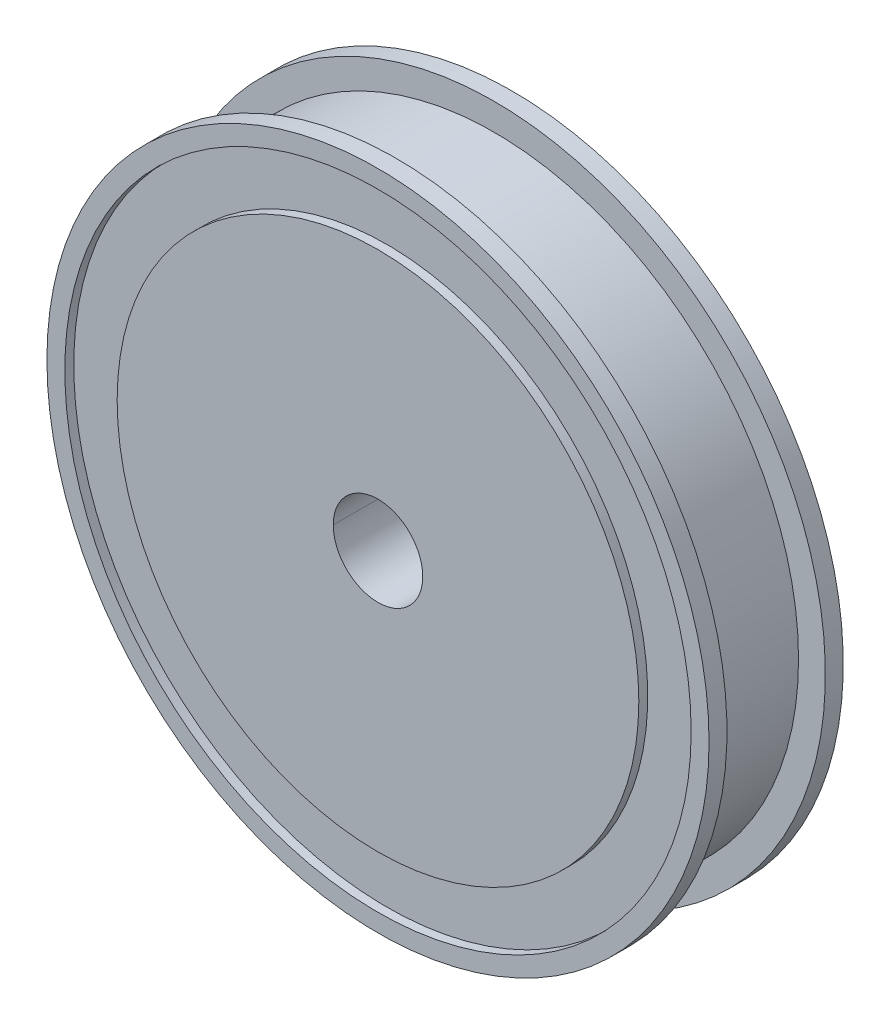
ISO-10303-21;
HEADER;
FILE_DESCRIPTION(('STEP AP214'),'2;1');
FILE_NAME('part.step','',(''),(''),'','','');
FILE_SCHEMA(('AUTOMOTIVE_DESIGN { 1 0 10303 214 1 1 1 1 }'));
ENDSEC;
DATA;
#1=APPLICATION_CONTEXT('core data for automotive mechanical design processes');
#2=APPLICATION_PROTOCOL_DEFINITION('international standard','automotive_design',2000,#1);
#3=PRODUCT_CONTEXT('',#1,'mechanical');
#4=PRODUCT('Part','Part','',(#3));
#5=PRODUCT_RELATED_PRODUCT_CATEGORY('part','',(#4));
#6=PRODUCT_DEFINITION_FORMATION('','',#4);
#7=PRODUCT_DEFINITION_CONTEXT('part definition',#1,'design');
#8=PRODUCT_DEFINITION('design','',#6,#7);
#9=PRODUCT_DEFINITION_SHAPE('','',#8);
#10=(LENGTH_UNIT() NAMED_UNIT(*) SI_UNIT(.MILLI.,.METRE.));
#11=(NAMED_UNIT(*) PLANE_ANGLE_UNIT() SI_UNIT($,.RADIAN.));
#12=(NAMED_UNIT(*) SI_UNIT($,.STERADIAN.) SOLID_ANGLE_UNIT());
#13=UNCERTAINTY_MEASURE_WITH_UNIT(LENGTH_MEASURE(1.E-05),#10,'distance_accuracy_value','');
#14=(GEOMETRIC_REPRESENTATION_CONTEXT(3) GLOBAL_UNCERTAINTY_ASSIGNED_CONTEXT((#13)) GLOBAL_UNIT_ASSIGNED_CONTEXT((#10,
#11,#12)) REPRESENTATION_CONTEXT('',''));
#15=CARTESIAN_POINT('',(0.,0.,0.));
#16=DIRECTION('',(0.,0.,1.));
#17=DIRECTION('',(1.,0.,0.));
#18=AXIS2_PLACEMENT_3D('',#15,#16,#17);
#19=CARTESIAN_POINT('',(0.,0.,1.));
#20=DIRECTION('',(0.,0.,-1.));
#21=DIRECTION('',(-1.,0.,0.));
#22=AXIS2_PLACEMENT_3D('',#19,#20,#21);
#23=CYLINDRICAL_SURFACE('',#22,5.);
#24=CARTESIAN_POINT('',(0.,0.,1.));
#25=DIRECTION('',(0.,0.,-1.));
#26=DIRECTION('',(-1.,0.,0.));
#27=AXIS2_PLACEMENT_3D('',#24,#25,#26);
#28=CIRCLE('',#27,5.);
#29=CARTESIAN_POINT('',(-5.,0.,1.));
#30=VERTEX_POINT('',#29);
#31=CARTESIAN_POINT('',(5.,0.,1.));
#32=VERTEX_POINT('',#31);
#33=EDGE_CURVE('E83',#30,#32,#28,.T.);
#34=ORIENTED_EDGE('',*,*,#33,.F.);
#35=DIRECTION('',(0.,0.,-1.));
#36=VECTOR('',#35,1.);
#37=CARTESIAN_POINT('',(-5.,0.,1.));
#38=LINE('',#37,#36);
#39=CARTESIAN_POINT('',(-5.,0.,-14.));
#40=VERTEX_POINT('',#39);
#41=EDGE_CURVE('E12',#30,#40,#38,.T.);
#42=ORIENTED_EDGE('',*,*,#41,.T.);
#43=CARTESIAN_POINT('',(0.,0.,-14.));
#44=DIRECTION('',(0.,0.,-1.));
#45=DIRECTION('',(-1.,0.,0.));
#46=AXIS2_PLACEMENT_3D('',#43,#44,#45);
#47=CIRCLE('',#46,5.);
#48=CARTESIAN_POINT('',(5.,0.,-14.));
#49=VERTEX_POINT('',#48);
#50=EDGE_CURVE('E92',#40,#49,#47,.T.);
#51=ORIENTED_EDGE('',*,*,#50,.T.);
#52=DIRECTION('',(0.,0.,1.));
#53=VECTOR('',#52,1.);
#54=CARTESIAN_POINT('',(5.,0.,1.));
#55=LINE('',#54,#53);
#56=EDGE_CURVE('E66',#49,#32,#55,.T.);
#57=ORIENTED_EDGE('',*,*,#56,.T.);
#58=EDGE_LOOP('',(#34,#42,#51,#57));
#59=FACE_BOUND('',#58,.T.);
#60=ADVANCED_FACE('F57',(#59),#23,.F.);
#61=CARTESIAN_POINT('',(0.,0.,1.));
#62=DIRECTION('',(0.,0.,-1.));
#63=DIRECTION('',(-1.,0.,0.));
#64=AXIS2_PLACEMENT_3D('',#61,#62,#63);
#65=CYLINDRICAL_SURFACE('',#64,35.);
#66=CARTESIAN_POINT('',(0.,0.,1.));
#67=DIRECTION('',(0.,0.,1.));
#68=DIRECTION('',(1.,0.,0.));
#69=AXIS2_PLACEMENT_3D('',#66,#67,#68);
#70=CIRCLE('',#69,35.);
#71=CARTESIAN_POINT('',(35.,0.,1.));
#72=VERTEX_POINT('',#71);
#73=EDGE_CURVE('E139',#72,#72,#70,.T.);
#74=ORIENTED_EDGE('',*,*,#73,.T.);
#75=EDGE_LOOP('',(#74));
#76=FACE_BOUND('',#75,.T.);
#77=CARTESIAN_POINT('',(0.,0.,0.));
#78=DIRECTION('',(0.,0.,1.));
#79=DIRECTION('',(1.,0.,0.));
#80=AXIS2_PLACEMENT_3D('',#77,#78,#79);
#81=CIRCLE('',#80,35.);
#82=CARTESIAN_POINT('',(35.,0.,0.));
#83=VERTEX_POINT('',#82);
#84=EDGE_CURVE('E138',#83,#83,#81,.T.);
#85=ORIENTED_EDGE('',*,*,#84,.F.);
#86=EDGE_LOOP('',(#85));
#87=FACE_BOUND('',#86,.T.);
#88=ADVANCED_FACE('F59',(#76,#87),#65,.F.);
#89=CARTESIAN_POINT('',(0.,0.,1.));
#90=DIRECTION('',(0.,0.,-1.));
#91=DIRECTION('',(-1.,0.,0.));
#92=AXIS2_PLACEMENT_3D('',#89,#90,#91);
#93=CYLINDRICAL_SURFACE('',#92,37.);
#94=CARTESIAN_POINT('',(0.,0.,1.));
#95=DIRECTION('',(0.,0.,1.));
#96=DIRECTION('',(1.,0.,0.));
#97=AXIS2_PLACEMENT_3D('',#94,#95,#96);
#98=CIRCLE('',#97,37.);
#99=CARTESIAN_POINT('',(37.,0.,1.));
#100=VERTEX_POINT('',#99);
#101=EDGE_CURVE('E143',#100,#100,#98,.T.);
#102=ORIENTED_EDGE('',*,*,#101,.F.);
#103=EDGE_LOOP('',(#102));
#104=FACE_BOUND('',#103,.T.);
#105=CARTESIAN_POINT('',(0.,0.,-1.));
#106=DIRECTION('',(0.,0.,-1.));
#107=DIRECTION('',(-1.,0.,0.));
#108=AXIS2_PLACEMENT_3D('',#105,#106,#107);
#109=CIRCLE('',#108,37.);
#110=CARTESIAN_POINT('',(-37.,0.,-1.));
#111=VERTEX_POINT('',#110);
#112=EDGE_CURVE('E134',#111,#111,#109,.T.);
#113=ORIENTED_EDGE('',*,*,#112,.F.);
#114=EDGE_LOOP('',(#113));
#115=FACE_BOUND('',#114,.T.);
#116=ADVANCED_FACE('F184',(#104,#115),#93,.T.);
#117=CARTESIAN_POINT('',(0.,0.,1.));
#118=DIRECTION('',(0.,0.,1.));
#119=DIRECTION('',(1.,0.,0.));
#120=AXIS2_PLACEMENT_3D('',#117,#118,#119);
#121=PLANE('',#120);
#122=ORIENTED_EDGE('',*,*,#73,.F.);
#123=EDGE_LOOP('',(#122));
#124=FACE_BOUND('',#123,.T.);
#125=ORIENTED_EDGE('',*,*,#101,.T.);
#126=EDGE_LOOP('',(#125));
#127=FACE_BOUND('',#126,.T.);
#128=ADVANCED_FACE('F228',(#124,#127),#121,.T.);
#129=CARTESIAN_POINT('',(0.,0.,0.));
#130=DIRECTION('',(0.,0.,-1.));
#131=DIRECTION('',(-1.,0.,0.));
#132=AXIS2_PLACEMENT_3D('',#129,#130,#131);
#133=PLANE('',#132);
#134=CARTESIAN_POINT('',(0.,0.,0.));
#135=DIRECTION('',(0.,0.,-1.));
#136=DIRECTION('',(-1.,0.,0.));
#137=AXIS2_PLACEMENT_3D('',#134,#135,#136);
#138=CIRCLE('',#137,29.15);
#139=CARTESIAN_POINT('',(-29.15,0.,0.));
#140=VERTEX_POINT('',#139);
#141=EDGE_CURVE('E130',#140,#140,#138,.F.);
#142=ORIENTED_EDGE('',*,*,#141,.F.);
#143=EDGE_LOOP('',(#142));
#144=FACE_BOUND('',#143,.T.);
#145=ORIENTED_EDGE('',*,*,#84,.T.);
#146=EDGE_LOOP('',(#145));
#147=FACE_BOUND('',#146,.T.);
#148=ADVANCED_FACE('F224',(#144,#147),#133,.F.);
#149=CARTESIAN_POINT('',(0.,0.,-1.));
#150=DIRECTION('',(0.,0.,-1.));
#151=DIRECTION('',(-1.,0.,0.));
#152=AXIS2_PLACEMENT_3D('',#149,#150,#151);
#153=PLANE('',#152);
#154=CARTESIAN_POINT('',(0.,0.,-1.));
#155=DIRECTION('',(0.,0.,-1.));
#156=DIRECTION('',(-1.,0.,0.));
#157=AXIS2_PLACEMENT_3D('',#154,#155,#156);
#158=CIRCLE('',#157,34.);
#159=CARTESIAN_POINT('',(-34.,0.,-1.));
#160=VERTEX_POINT('',#159);
#161=EDGE_CURVE('E126',#160,#160,#158,.T.);
#162=ORIENTED_EDGE('',*,*,#161,.F.);
#163=EDGE_LOOP('',(#162));
#164=FACE_BOUND('',#163,.T.);
#165=ORIENTED_EDGE('',*,*,#112,.T.);
#166=EDGE_LOOP('',(#165));
#167=FACE_BOUND('',#166,.T.);
#168=ADVANCED_FACE('F220',(#164,#167),#153,.T.);
#169=CARTESIAN_POINT('',(0.,0.,1.));
#170=DIRECTION('',(0.,0.,-1.));
#171=DIRECTION('',(-1.,0.,0.));
#172=AXIS2_PLACEMENT_3D('',#169,#170,#171);
#173=CYLINDRICAL_SURFACE('',#172,29.15);
#174=CARTESIAN_POINT('',(0.,0.,1.));
#175=DIRECTION('',(0.,0.,1.));
#176=DIRECTION('',(1.,0.,0.));
#177=AXIS2_PLACEMENT_3D('',#174,#175,#176);
#178=CIRCLE('',#177,29.15);
#179=CARTESIAN_POINT('',(29.15,0.,1.));
#180=VERTEX_POINT('',#179);
#181=EDGE_CURVE('E125',#180,#180,#178,.T.);
#182=ORIENTED_EDGE('',*,*,#181,.F.);
#183=EDGE_LOOP('',(#182));
#184=FACE_BOUND('',#183,.T.);
#185=ORIENTED_EDGE('',*,*,#141,.T.);
#186=EDGE_LOOP('',(#185));
#187=FACE_BOUND('',#186,.T.);
#188=ADVANCED_FACE('F217',(#184,#187),#173,.T.);
#189=CARTESIAN_POINT('',(0.,0.,1.));
#190=DIRECTION('',(0.,0.,1.));
#191=DIRECTION('',(1.,0.,0.));
#192=AXIS2_PLACEMENT_3D('',#189,#190,#191);
#193=PLANE('',#192);
#194=EDGE_CURVE('E87',#32,#30,#28,.T.);
#195=ORIENTED_EDGE('',*,*,#194,.T.);
#196=ORIENTED_EDGE('',*,*,#33,.T.);
#197=EDGE_LOOP('',(#195,#196));
#198=FACE_BOUND('',#197,.T.);
#199=ORIENTED_EDGE('',*,*,#181,.T.);
#200=EDGE_LOOP('',(#199));
#201=FACE_BOUND('',#200,.T.);
#202=ADVANCED_FACE('F85',(#198,#201),#193,.T.);
#203=CARTESIAN_POINT('',(0.,0.,-12.));
#204=DIRECTION('',(0.,0.,1.));
#205=DIRECTION('',(1.,0.,0.));
#206=AXIS2_PLACEMENT_3D('',#203,#204,#205);
#207=CYLINDRICAL_SURFACE('',#206,34.);
#208=CARTESIAN_POINT('',(0.,0.,-12.));
#209=DIRECTION('',(0.,0.,-1.));
#210=DIRECTION('',(-1.,0.,0.));
#211=AXIS2_PLACEMENT_3D('',#208,#209,#210);
#212=CIRCLE('',#211,34.);
#213=CARTESIAN_POINT('',(-34.,0.,-12.));
#214=VERTEX_POINT('',#213);
#215=EDGE_CURVE('E121',#214,#214,#212,.T.);
#216=ORIENTED_EDGE('',*,*,#215,.F.);
#217=EDGE_LOOP('',(#216));
#218=FACE_BOUND('',#217,.T.);
#219=ORIENTED_EDGE('',*,*,#161,.T.);
#220=EDGE_LOOP('',(#219));
#221=FACE_BOUND('',#220,.T.);
#222=ADVANCED_FACE('F207',(#218,#221),#207,.T.);
#223=CARTESIAN_POINT('',(0.,0.,-13.));
#224=DIRECTION('',(0.,0.,1.));
#225=DIRECTION('',(1.,0.,0.));
#226=AXIS2_PLACEMENT_3D('',#223,#224,#225);
#227=CYLINDRICAL_SURFACE('',#226,37.);
#228=CARTESIAN_POINT('',(0.,0.,-12.));
#229=DIRECTION('',(0.,0.,-1.));
#230=DIRECTION('',(-1.,0.,0.));
#231=AXIS2_PLACEMENT_3D('',#228,#229,#230);
#232=CIRCLE('',#231,37.);
#233=CARTESIAN_POINT('',(-37.,0.,-12.));
#234=VERTEX_POINT('',#233);
#235=EDGE_CURVE('E117',#234,#234,#232,.T.);
#236=ORIENTED_EDGE('',*,*,#235,.T.);
#237=EDGE_LOOP('',(#236));
#238=FACE_BOUND('',#237,.T.);
#239=CARTESIAN_POINT('',(0.,0.,-14.));
#240=DIRECTION('',(0.,0.,-1.));
#241=DIRECTION('',(-1.,0.,0.));
#242=AXIS2_PLACEMENT_3D('',#239,#240,#241);
#243=CIRCLE('',#242,37.);
#244=CARTESIAN_POINT('',(-37.,0.,-14.));
#245=VERTEX_POINT('',#244);
#246=EDGE_CURVE('E113',#245,#245,#243,.T.);
#247=ORIENTED_EDGE('',*,*,#246,.F.);
#248=EDGE_LOOP('',(#247));
#249=FACE_BOUND('',#248,.T.);
#250=ADVANCED_FACE('F200',(#238,#249),#227,.T.);
#251=CARTESIAN_POINT('',(0.,0.,-12.));
#252=DIRECTION('',(0.,0.,-1.));
#253=DIRECTION('',(-1.,0.,0.));
#254=AXIS2_PLACEMENT_3D('',#251,#252,#253);
#255=PLANE('',#254);
#256=ORIENTED_EDGE('',*,*,#215,.T.);
#257=EDGE_LOOP('',(#256));
#258=FACE_BOUND('',#257,.T.);
#259=ORIENTED_EDGE('',*,*,#235,.F.);
#260=EDGE_LOOP('',(#259));
#261=FACE_BOUND('',#260,.T.);
#262=ADVANCED_FACE('F195',(#258,#261),#255,.F.);
#263=CARTESIAN_POINT('',(0.,0.,-14.));
#264=DIRECTION('',(0.,0.,1.));
#265=DIRECTION('',(1.,0.,0.));
#266=AXIS2_PLACEMENT_3D('',#263,#264,#265);
#267=CYLINDRICAL_SURFACE('',#266,35.);
#268=CARTESIAN_POINT('',(0.,0.,-14.));
#269=DIRECTION('',(0.,0.,-1.));
#270=DIRECTION('',(-1.,0.,0.));
#271=AXIS2_PLACEMENT_3D('',#268,#269,#270);
#272=CIRCLE('',#271,35.);
#273=CARTESIAN_POINT('',(-35.,0.,-14.));
#274=VERTEX_POINT('',#273);
#275=EDGE_CURVE('E108',#274,#274,#272,.T.);
#276=ORIENTED_EDGE('',*,*,#275,.T.);
#277=EDGE_LOOP('',(#276));
#278=FACE_BOUND('',#277,.T.);
#279=CARTESIAN_POINT('',(0.,0.,-13.));
#280=DIRECTION('',(0.,0.,-1.));
#281=DIRECTION('',(-1.,0.,0.));
#282=AXIS2_PLACEMENT_3D('',#279,#280,#281);
#283=CIRCLE('',#282,35.);
#284=CARTESIAN_POINT('',(-35.,0.,-13.));
#285=VERTEX_POINT('',#284);
#286=EDGE_CURVE('E95',#285,#285,#283,.F.);
#287=ORIENTED_EDGE('',*,*,#286,.T.);
#288=EDGE_LOOP('',(#287));
#289=FACE_BOUND('',#288,.T.);
#290=ADVANCED_FACE('F157',(#278,#289),#267,.F.);
#291=CARTESIAN_POINT('',(0.,0.,-14.));
#292=DIRECTION('',(0.,0.,-1.));
#293=DIRECTION('',(-1.,0.,0.));
#294=AXIS2_PLACEMENT_3D('',#291,#292,#293);
#295=PLANE('',#294);
#296=ORIENTED_EDGE('',*,*,#275,.F.);
#297=EDGE_LOOP('',(#296));
#298=FACE_BOUND('',#297,.T.);
#299=ORIENTED_EDGE('',*,*,#246,.T.);
#300=EDGE_LOOP('',(#299));
#301=FACE_BOUND('',#300,.T.);
#302=ADVANCED_FACE('F162',(#298,#301),#295,.T.);
#303=CARTESIAN_POINT('',(0.,0.,-13.));
#304=DIRECTION('',(0.,0.,-1.));
#305=DIRECTION('',(-1.,0.,0.));
#306=AXIS2_PLACEMENT_3D('',#303,#304,#305);
#307=PLANE('',#306);
#308=CARTESIAN_POINT('',(0.,0.,-13.));
#309=DIRECTION('',(0.,0.,-1.));
#310=DIRECTION('',(-1.,0.,0.));
#311=AXIS2_PLACEMENT_3D('',#308,#309,#310);
#312=CIRCLE('',#311,29.15);
#313=CARTESIAN_POINT('',(-29.15,0.,-13.));
#314=VERTEX_POINT('',#313);
#315=EDGE_CURVE('E98',#314,#314,#312,.T.);
#316=ORIENTED_EDGE('',*,*,#315,.F.);
#317=EDGE_LOOP('',(#316));
#318=FACE_BOUND('',#317,.T.);
#319=ORIENTED_EDGE('',*,*,#286,.F.);
#320=EDGE_LOOP('',(#319));
#321=FACE_BOUND('',#320,.T.);
#322=ADVANCED_FACE('F159',(#318,#321),#307,.T.);
#323=CARTESIAN_POINT('',(0.,0.,-14.));
#324=DIRECTION('',(0.,0.,1.));
#325=DIRECTION('',(1.,0.,0.));
#326=AXIS2_PLACEMENT_3D('',#323,#324,#325);
#327=CYLINDRICAL_SURFACE('',#326,29.15);
#328=CARTESIAN_POINT('',(0.,0.,-14.));
#329=DIRECTION('',(0.,0.,-1.));
#330=DIRECTION('',(-1.,0.,0.));
#331=AXIS2_PLACEMENT_3D('',#328,#329,#330);
#332=CIRCLE('',#331,29.15);
#333=CARTESIAN_POINT('',(-29.15,0.,-14.));
#334=VERTEX_POINT('',#333);
#335=EDGE_CURVE('E101',#334,#334,#332,.T.);
#336=ORIENTED_EDGE('',*,*,#335,.F.);
#337=EDGE_LOOP('',(#336));
#338=FACE_BOUND('',#337,.T.);
#339=ORIENTED_EDGE('',*,*,#315,.T.);
#340=EDGE_LOOP('',(#339));
#341=FACE_BOUND('',#340,.T.);
#342=ADVANCED_FACE('F161',(#338,#341),#327,.T.);
#343=CARTESIAN_POINT('',(0.,0.,-14.));
#344=DIRECTION('',(0.,0.,-1.));
#345=DIRECTION('',(-1.,0.,0.));
#346=AXIS2_PLACEMENT_3D('',#343,#344,#345);
#347=PLANE('',#346);
#348=EDGE_CURVE('E89',#49,#40,#47,.T.);
#349=ORIENTED_EDGE('',*,*,#348,.F.);
#350=ORIENTED_EDGE('',*,*,#50,.F.);
#351=EDGE_LOOP('',(#349,#350));
#352=FACE_BOUND('',#351,.T.);
#353=ORIENTED_EDGE('',*,*,#335,.T.);
#354=EDGE_LOOP('',(#353));
#355=FACE_BOUND('',#354,.T.);
#356=ADVANCED_FACE('F169',(#352,#355),#347,.T.);
#357=ORIENTED_EDGE('',*,*,#41,.F.);
#358=ORIENTED_EDGE('',*,*,#194,.F.);
#359=ORIENTED_EDGE('',*,*,#56,.F.);
#360=ORIENTED_EDGE('',*,*,#348,.T.);
#361=EDGE_LOOP('',(#357,#358,#359,#360));
#362=FACE_BOUND('',#361,.T.);
#363=ADVANCED_FACE('F96',(#362),#23,.F.);
#364=CLOSED_SHELL('',(#60,#88,#116,#128,#148,#168,#188,#202,#222,#250,#262,#290,#302,#322,#342,
#356,#363));
#365=MANIFOLD_SOLID_BREP('B2',#364);
#366=ADVANCED_BREP_SHAPE_REPRESENTATION('',(#18,#365),#14);
#367=SHAPE_DEFINITION_REPRESENTATION(#9,#366);
ENDSEC;
END-ISO-10303-21;
